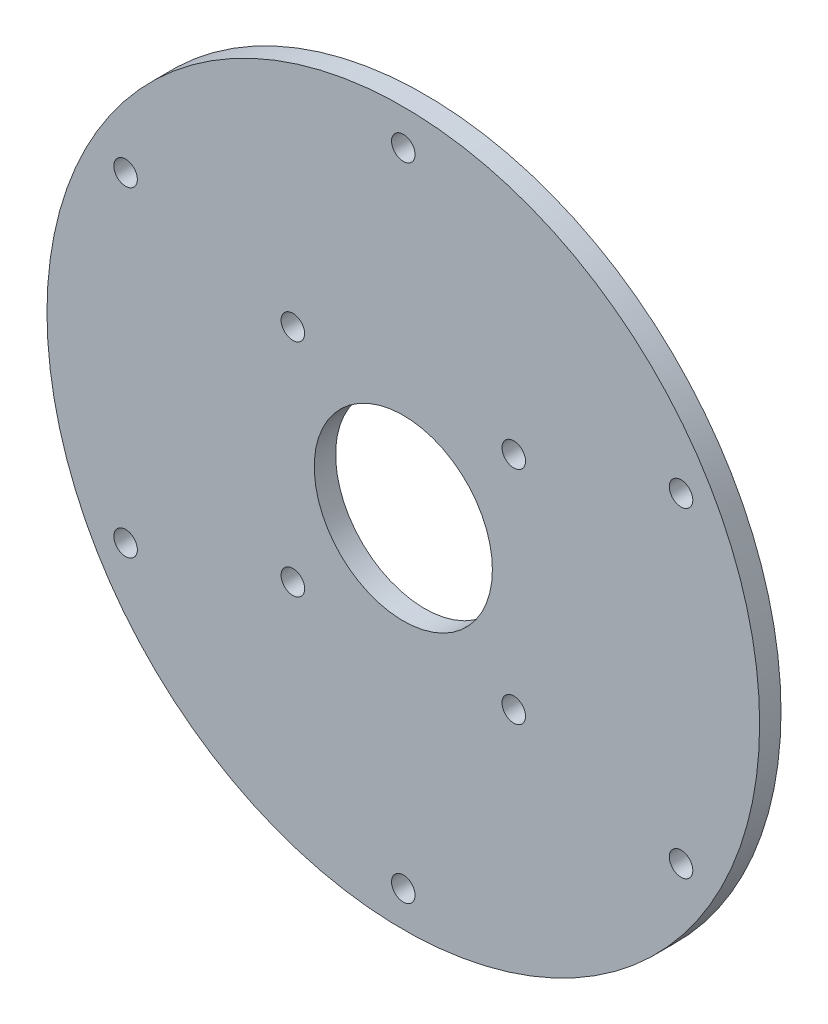
ISO-10303-21;
HEADER;
FILE_DESCRIPTION(('STEP AP214'),'2;1');
FILE_NAME('part.step','',(''),(''),'','','');
FILE_SCHEMA(('AUTOMOTIVE_DESIGN { 1 0 10303 214 1 1 1 1 }'));
ENDSEC;
DATA;
#1=APPLICATION_CONTEXT('core data for automotive mechanical design processes');
#2=APPLICATION_PROTOCOL_DEFINITION('international standard','automotive_design',2000,#1);
#3=PRODUCT_CONTEXT('',#1,'mechanical');
#4=PRODUCT('Part','Part','',(#3));
#5=PRODUCT_RELATED_PRODUCT_CATEGORY('part','',(#4));
#6=PRODUCT_DEFINITION_FORMATION('','',#4);
#7=PRODUCT_DEFINITION_CONTEXT('part definition',#1,'design');
#8=PRODUCT_DEFINITION('design','',#6,#7);
#9=PRODUCT_DEFINITION_SHAPE('','',#8);
#10=(LENGTH_UNIT() NAMED_UNIT(*) SI_UNIT(.MILLI.,.METRE.));
#11=(NAMED_UNIT(*) PLANE_ANGLE_UNIT() SI_UNIT($,.RADIAN.));
#12=(NAMED_UNIT(*) SI_UNIT($,.STERADIAN.) SOLID_ANGLE_UNIT());
#13=UNCERTAINTY_MEASURE_WITH_UNIT(LENGTH_MEASURE(1.E-05),#10,'distance_accuracy_value','');
#14=(GEOMETRIC_REPRESENTATION_CONTEXT(3) GLOBAL_UNCERTAINTY_ASSIGNED_CONTEXT((#13)) GLOBAL_UNIT_ASSIGNED_CONTEXT((#10,
#11,#12)) REPRESENTATION_CONTEXT('',''));
#15=CARTESIAN_POINT('',(0.,0.,0.));
#16=DIRECTION('',(0.,0.,1.));
#17=DIRECTION('',(1.,0.,0.));
#18=AXIS2_PLACEMENT_3D('',#15,#16,#17);
#19=CARTESIAN_POINT('',(0.,0.,3.));
#20=DIRECTION('',(0.,0.,1.));
#21=DIRECTION('',(1.,0.,0.));
#22=AXIS2_PLACEMENT_3D('',#19,#20,#21);
#23=PLANE('',#22);
#24=CARTESIAN_POINT('',(-2.94902990916057E-13,-45.,3.));
#25=DIRECTION('',(0.,0.,1.));
#26=DIRECTION('',(1.,0.,0.));
#27=AXIS2_PLACEMENT_3D('',#24,#25,#26);
#28=CIRCLE('',#27,1.65);
#29=CARTESIAN_POINT('',(1.64999999999971,-45.,3.));
#30=VERTEX_POINT('',#29);
#31=EDGE_CURVE('E103',#30,#30,#28,.T.);
#32=ORIENTED_EDGE('',*,*,#31,.F.);
#33=EDGE_LOOP('',(#32));
#34=FACE_BOUND('',#33,.T.);
#35=CARTESIAN_POINT('',(38.9711431702998,22.4999999999999,3.));
#36=DIRECTION('',(0.,0.,1.));
#37=DIRECTION('',(1.,0.,0.));
#38=AXIS2_PLACEMENT_3D('',#35,#36,#37);
#39=CIRCLE('',#38,1.65);
#40=CARTESIAN_POINT('',(40.6211431702998,22.4999999999999,3.));
#41=VERTEX_POINT('',#40);
#42=EDGE_CURVE('E91',#41,#41,#39,.T.);
#43=ORIENTED_EDGE('',*,*,#42,.F.);
#44=EDGE_LOOP('',(#43));
#45=FACE_BOUND('',#44,.T.);
#46=CARTESIAN_POINT('',(-15.5000000000002,-15.4999999999998,3.));
#47=DIRECTION('',(0.,0.,1.));
#48=DIRECTION('',(1.,0.,0.));
#49=AXIS2_PLACEMENT_3D('',#46,#47,#48);
#50=CIRCLE('',#49,1.65);
#51=CARTESIAN_POINT('',(-13.8500000000002,-15.4999999999998,3.));
#52=VERTEX_POINT('',#51);
#53=EDGE_CURVE('E79',#52,#52,#50,.T.);
#54=ORIENTED_EDGE('',*,*,#53,.F.);
#55=EDGE_LOOP('',(#54));
#56=FACE_BOUND('',#55,.T.);
#57=CARTESIAN_POINT('',(15.5000000000001,15.4999999999999,3.));
#58=DIRECTION('',(0.,0.,1.));
#59=DIRECTION('',(1.,0.,0.));
#60=AXIS2_PLACEMENT_3D('',#57,#58,#59);
#61=CIRCLE('',#60,1.65);
#62=CARTESIAN_POINT('',(17.1500000000001,15.4999999999999,3.));
#63=VERTEX_POINT('',#62);
#64=EDGE_CURVE('E67',#63,#63,#61,.T.);
#65=ORIENTED_EDGE('',*,*,#64,.F.);
#66=EDGE_LOOP('',(#65));
#67=FACE_BOUND('',#66,.T.);
#68=CARTESIAN_POINT('',(0.,0.,3.));
#69=DIRECTION('',(0.,0.,1.));
#70=DIRECTION('',(1.,0.,0.));
#71=AXIS2_PLACEMENT_3D('',#68,#69,#70);
#72=CIRCLE('',#71,12.5);
#73=CARTESIAN_POINT('',(12.5,0.,3.));
#74=VERTEX_POINT('',#73);
#75=EDGE_CURVE('E55',#74,#74,#72,.T.);
#76=ORIENTED_EDGE('',*,*,#75,.F.);
#77=EDGE_LOOP('',(#76));
#78=FACE_BOUND('',#77,.T.);
#79=CARTESIAN_POINT('',(0.,0.,3.));
#80=DIRECTION('',(0.,0.,1.));
#81=DIRECTION('',(1.,0.,0.));
#82=AXIS2_PLACEMENT_3D('',#79,#80,#81);
#83=CIRCLE('',#82,50.);
#84=CARTESIAN_POINT('',(50.,0.,3.));
#85=VERTEX_POINT('',#84);
#86=EDGE_CURVE('E10',#85,#85,#83,.T.);
#87=ORIENTED_EDGE('',*,*,#86,.T.);
#88=EDGE_LOOP('',(#87));
#89=FACE_BOUND('',#88,.T.);
#90=CARTESIAN_POINT('',(-15.5,15.5,3.));
#91=DIRECTION('',(0.,0.,1.));
#92=DIRECTION('',(1.,0.,0.));
#93=AXIS2_PLACEMENT_3D('',#90,#91,#92);
#94=CIRCLE('',#93,1.65);
#95=CARTESIAN_POINT('',(-13.85,15.5,3.));
#96=VERTEX_POINT('',#95);
#97=EDGE_CURVE('E50',#96,#96,#94,.T.);
#98=ORIENTED_EDGE('',*,*,#97,.F.);
#99=EDGE_LOOP('',(#98));
#100=FACE_BOUND('',#99,.T.);
#101=CARTESIAN_POINT('',(-38.9711431702998,22.4999999999999,3.));
#102=DIRECTION('',(0.,0.,1.));
#103=DIRECTION('',(1.,0.,0.));
#104=AXIS2_PLACEMENT_3D('',#101,#102,#103);
#105=CIRCLE('',#104,1.65);
#106=CARTESIAN_POINT('',(-37.3211431702998,22.4999999999999,3.));
#107=VERTEX_POINT('',#106);
#108=EDGE_CURVE('E61',#107,#107,#105,.T.);
#109=ORIENTED_EDGE('',*,*,#108,.F.);
#110=EDGE_LOOP('',(#109));
#111=FACE_BOUND('',#110,.T.);
#112=CARTESIAN_POINT('',(15.4999999999999,-15.5000000000001,3.));
#113=DIRECTION('',(0.,0.,1.));
#114=DIRECTION('',(1.,0.,0.));
#115=AXIS2_PLACEMENT_3D('',#112,#113,#114);
#116=CIRCLE('',#115,1.65);
#117=CARTESIAN_POINT('',(17.1499999999999,-15.5000000000001,3.));
#118=VERTEX_POINT('',#117);
#119=EDGE_CURVE('E73',#118,#118,#116,.T.);
#120=ORIENTED_EDGE('',*,*,#119,.F.);
#121=EDGE_LOOP('',(#120));
#122=FACE_BOUND('',#121,.T.);
#123=CARTESIAN_POINT('',(0.,45.,3.));
#124=DIRECTION('',(0.,0.,1.));
#125=DIRECTION('',(1.,0.,0.));
#126=AXIS2_PLACEMENT_3D('',#123,#124,#125);
#127=CIRCLE('',#126,1.65000000000001);
#128=CARTESIAN_POINT('',(1.64999999999998,45.,3.));
#129=VERTEX_POINT('',#128);
#130=EDGE_CURVE('E85',#129,#129,#127,.T.);
#131=ORIENTED_EDGE('',*,*,#130,.F.);
#132=EDGE_LOOP('',(#131));
#133=FACE_BOUND('',#132,.T.);
#134=CARTESIAN_POINT('',(38.9711431702997,-22.5000000000002,3.));
#135=DIRECTION('',(0.,0.,1.));
#136=DIRECTION('',(1.,0.,0.));
#137=AXIS2_PLACEMENT_3D('',#134,#135,#136);
#138=CIRCLE('',#137,1.65);
#139=CARTESIAN_POINT('',(40.6211431702997,-22.5000000000002,3.));
#140=VERTEX_POINT('',#139);
#141=EDGE_CURVE('E97',#140,#140,#138,.T.);
#142=ORIENTED_EDGE('',*,*,#141,.F.);
#143=EDGE_LOOP('',(#142));
#144=FACE_BOUND('',#143,.T.);
#145=CARTESIAN_POINT('',(-38.9711431702999,-22.4999999999997,3.));
#146=DIRECTION('',(0.,0.,1.));
#147=DIRECTION('',(1.,0.,0.));
#148=AXIS2_PLACEMENT_3D('',#145,#146,#147);
#149=CIRCLE('',#148,1.65);
#150=CARTESIAN_POINT('',(-37.3211431702999,-22.4999999999997,3.));
#151=VERTEX_POINT('',#150);
#152=EDGE_CURVE('E109',#151,#151,#149,.T.);
#153=ORIENTED_EDGE('',*,*,#152,.F.);
#154=EDGE_LOOP('',(#153));
#155=FACE_BOUND('',#154,.T.);
#156=ADVANCED_FACE('F39',(#34,#45,#56,#67,#78,#89,#100,#111,#122,#133,#144,#155),#23,.T.);
#157=CARTESIAN_POINT('',(0.,0.,0.));
#158=DIRECTION('',(0.,0.,1.));
#159=DIRECTION('',(1.,0.,0.));
#160=AXIS2_PLACEMENT_3D('',#157,#158,#159);
#161=PLANE('',#160);
#162=CARTESIAN_POINT('',(0.,0.,0.));
#163=DIRECTION('',(0.,0.,1.));
#164=DIRECTION('',(1.,0.,0.));
#165=AXIS2_PLACEMENT_3D('',#162,#163,#164);
#166=CIRCLE('',#165,50.);
#167=CARTESIAN_POINT('',(50.,0.,0.));
#168=VERTEX_POINT('',#167);
#169=EDGE_CURVE('E43',#168,#168,#166,.T.);
#170=ORIENTED_EDGE('',*,*,#169,.F.);
#171=EDGE_LOOP('',(#170));
#172=FACE_BOUND('',#171,.T.);
#173=CARTESIAN_POINT('',(-15.5,15.5,0.));
#174=DIRECTION('',(0.,0.,1.));
#175=DIRECTION('',(1.,0.,0.));
#176=AXIS2_PLACEMENT_3D('',#173,#174,#175);
#177=CIRCLE('',#176,1.65);
#178=CARTESIAN_POINT('',(-13.85,15.5,0.));
#179=VERTEX_POINT('',#178);
#180=EDGE_CURVE('E52',#179,#179,#177,.T.);
#181=ORIENTED_EDGE('',*,*,#180,.T.);
#182=EDGE_LOOP('',(#181));
#183=FACE_BOUND('',#182,.T.);
#184=CARTESIAN_POINT('',(0.,0.,0.));
#185=DIRECTION('',(0.,0.,1.));
#186=DIRECTION('',(1.,0.,0.));
#187=AXIS2_PLACEMENT_3D('',#184,#185,#186);
#188=CIRCLE('',#187,12.5);
#189=CARTESIAN_POINT('',(12.5,0.,0.));
#190=VERTEX_POINT('',#189);
#191=EDGE_CURVE('E58',#190,#190,#188,.T.);
#192=ORIENTED_EDGE('',*,*,#191,.T.);
#193=EDGE_LOOP('',(#192));
#194=FACE_BOUND('',#193,.T.);
#195=CARTESIAN_POINT('',(-38.9711431702998,22.4999999999999,0.));
#196=DIRECTION('',(0.,0.,1.));
#197=DIRECTION('',(1.,0.,0.));
#198=AXIS2_PLACEMENT_3D('',#195,#196,#197);
#199=CIRCLE('',#198,1.65);
#200=CARTESIAN_POINT('',(-37.3211431702998,22.4999999999999,0.));
#201=VERTEX_POINT('',#200);
#202=EDGE_CURVE('E64',#201,#201,#199,.T.);
#203=ORIENTED_EDGE('',*,*,#202,.T.);
#204=EDGE_LOOP('',(#203));
#205=FACE_BOUND('',#204,.T.);
#206=CARTESIAN_POINT('',(15.5000000000001,15.4999999999999,0.));
#207=DIRECTION('',(0.,0.,1.));
#208=DIRECTION('',(1.,0.,0.));
#209=AXIS2_PLACEMENT_3D('',#206,#207,#208);
#210=CIRCLE('',#209,1.65);
#211=CARTESIAN_POINT('',(17.1500000000001,15.4999999999999,0.));
#212=VERTEX_POINT('',#211);
#213=EDGE_CURVE('E70',#212,#212,#210,.T.);
#214=ORIENTED_EDGE('',*,*,#213,.T.);
#215=EDGE_LOOP('',(#214));
#216=FACE_BOUND('',#215,.T.);
#217=CARTESIAN_POINT('',(15.4999999999999,-15.5000000000001,0.));
#218=DIRECTION('',(0.,0.,1.));
#219=DIRECTION('',(1.,0.,0.));
#220=AXIS2_PLACEMENT_3D('',#217,#218,#219);
#221=CIRCLE('',#220,1.65);
#222=CARTESIAN_POINT('',(17.1499999999999,-15.5000000000001,0.));
#223=VERTEX_POINT('',#222);
#224=EDGE_CURVE('E76',#223,#223,#221,.T.);
#225=ORIENTED_EDGE('',*,*,#224,.T.);
#226=EDGE_LOOP('',(#225));
#227=FACE_BOUND('',#226,.T.);
#228=CARTESIAN_POINT('',(-15.5000000000002,-15.4999999999998,0.));
#229=DIRECTION('',(0.,0.,1.));
#230=DIRECTION('',(1.,0.,0.));
#231=AXIS2_PLACEMENT_3D('',#228,#229,#230);
#232=CIRCLE('',#231,1.65);
#233=CARTESIAN_POINT('',(-13.8500000000002,-15.4999999999998,0.));
#234=VERTEX_POINT('',#233);
#235=EDGE_CURVE('E82',#234,#234,#232,.T.);
#236=ORIENTED_EDGE('',*,*,#235,.T.);
#237=EDGE_LOOP('',(#236));
#238=FACE_BOUND('',#237,.T.);
#239=CARTESIAN_POINT('',(0.,45.,0.));
#240=DIRECTION('',(0.,0.,1.));
#241=DIRECTION('',(1.,0.,0.));
#242=AXIS2_PLACEMENT_3D('',#239,#240,#241);
#243=CIRCLE('',#242,1.65000000000001);
#244=CARTESIAN_POINT('',(1.64999999999998,45.,0.));
#245=VERTEX_POINT('',#244);
#246=EDGE_CURVE('E88',#245,#245,#243,.T.);
#247=ORIENTED_EDGE('',*,*,#246,.T.);
#248=EDGE_LOOP('',(#247));
#249=FACE_BOUND('',#248,.T.);
#250=CARTESIAN_POINT('',(38.9711431702998,22.4999999999999,0.));
#251=DIRECTION('',(0.,0.,1.));
#252=DIRECTION('',(1.,0.,0.));
#253=AXIS2_PLACEMENT_3D('',#250,#251,#252);
#254=CIRCLE('',#253,1.65);
#255=CARTESIAN_POINT('',(40.6211431702998,22.4999999999999,0.));
#256=VERTEX_POINT('',#255);
#257=EDGE_CURVE('E94',#256,#256,#254,.T.);
#258=ORIENTED_EDGE('',*,*,#257,.T.);
#259=EDGE_LOOP('',(#258));
#260=FACE_BOUND('',#259,.T.);
#261=CARTESIAN_POINT('',(38.9711431702997,-22.5000000000002,0.));
#262=DIRECTION('',(0.,0.,1.));
#263=DIRECTION('',(1.,0.,0.));
#264=AXIS2_PLACEMENT_3D('',#261,#262,#263);
#265=CIRCLE('',#264,1.65);
#266=CARTESIAN_POINT('',(40.6211431702997,-22.5000000000002,0.));
#267=VERTEX_POINT('',#266);
#268=EDGE_CURVE('E100',#267,#267,#265,.T.);
#269=ORIENTED_EDGE('',*,*,#268,.T.);
#270=EDGE_LOOP('',(#269));
#271=FACE_BOUND('',#270,.T.);
#272=CARTESIAN_POINT('',(-2.94902990916057E-13,-45.,0.));
#273=DIRECTION('',(0.,0.,1.));
#274=DIRECTION('',(1.,0.,0.));
#275=AXIS2_PLACEMENT_3D('',#272,#273,#274);
#276=CIRCLE('',#275,1.65);
#277=CARTESIAN_POINT('',(1.64999999999971,-45.,0.));
#278=VERTEX_POINT('',#277);
#279=EDGE_CURVE('E106',#278,#278,#276,.T.);
#280=ORIENTED_EDGE('',*,*,#279,.T.);
#281=EDGE_LOOP('',(#280));
#282=FACE_BOUND('',#281,.T.);
#283=CARTESIAN_POINT('',(-38.9711431702999,-22.4999999999997,0.));
#284=DIRECTION('',(0.,0.,1.));
#285=DIRECTION('',(1.,0.,0.));
#286=AXIS2_PLACEMENT_3D('',#283,#284,#285);
#287=CIRCLE('',#286,1.65);
#288=CARTESIAN_POINT('',(-37.3211431702999,-22.4999999999997,0.));
#289=VERTEX_POINT('',#288);
#290=EDGE_CURVE('E112',#289,#289,#287,.T.);
#291=ORIENTED_EDGE('',*,*,#290,.T.);
#292=EDGE_LOOP('',(#291));
#293=FACE_BOUND('',#292,.T.);
#294=ADVANCED_FACE('F122',(#172,#183,#194,#205,#216,#227,#238,#249,#260,#271,#282,#293),#161,.F.);
#295=CARTESIAN_POINT('',(0.,0.,3.));
#296=DIRECTION('',(0.,0.,-1.));
#297=DIRECTION('',(-1.,0.,0.));
#298=AXIS2_PLACEMENT_3D('',#295,#296,#297);
#299=CYLINDRICAL_SURFACE('',#298,50.);
#300=ORIENTED_EDGE('',*,*,#86,.F.);
#301=EDGE_LOOP('',(#300));
#302=FACE_BOUND('',#301,.T.);
#303=ORIENTED_EDGE('',*,*,#169,.T.);
#304=EDGE_LOOP('',(#303));
#305=FACE_BOUND('',#304,.T.);
#306=ADVANCED_FACE('F41',(#302,#305),#299,.T.);
#307=CARTESIAN_POINT('',(-15.5,15.5,3.));
#308=DIRECTION('',(0.,0.,-1.));
#309=DIRECTION('',(-1.,0.,0.));
#310=AXIS2_PLACEMENT_3D('',#307,#308,#309);
#311=CYLINDRICAL_SURFACE('',#310,1.65);
#312=ORIENTED_EDGE('',*,*,#97,.T.);
#313=EDGE_LOOP('',(#312));
#314=FACE_BOUND('',#313,.T.);
#315=ORIENTED_EDGE('',*,*,#180,.F.);
#316=EDGE_LOOP('',(#315));
#317=FACE_BOUND('',#316,.T.);
#318=ADVANCED_FACE('F132',(#314,#317),#311,.F.);
#319=CARTESIAN_POINT('',(0.,0.,3.));
#320=DIRECTION('',(0.,0.,-1.));
#321=DIRECTION('',(-1.,0.,0.));
#322=AXIS2_PLACEMENT_3D('',#319,#320,#321);
#323=CYLINDRICAL_SURFACE('',#322,12.5);
#324=ORIENTED_EDGE('',*,*,#75,.T.);
#325=EDGE_LOOP('',(#324));
#326=FACE_BOUND('',#325,.T.);
#327=ORIENTED_EDGE('',*,*,#191,.F.);
#328=EDGE_LOOP('',(#327));
#329=FACE_BOUND('',#328,.T.);
#330=ADVANCED_FACE('F135',(#326,#329),#323,.F.);
#331=CARTESIAN_POINT('',(-38.9711431702998,22.4999999999999,3.));
#332=DIRECTION('',(0.,0.,-1.));
#333=DIRECTION('',(-1.,0.,0.));
#334=AXIS2_PLACEMENT_3D('',#331,#332,#333);
#335=CYLINDRICAL_SURFACE('',#334,1.65);
#336=ORIENTED_EDGE('',*,*,#108,.T.);
#337=EDGE_LOOP('',(#336));
#338=FACE_BOUND('',#337,.T.);
#339=ORIENTED_EDGE('',*,*,#202,.F.);
#340=EDGE_LOOP('',(#339));
#341=FACE_BOUND('',#340,.T.);
#342=ADVANCED_FACE('F139',(#338,#341),#335,.F.);
#343=CARTESIAN_POINT('',(15.5000000000001,15.4999999999999,3.));
#344=DIRECTION('',(0.,0.,-1.));
#345=DIRECTION('',(-1.,0.,0.));
#346=AXIS2_PLACEMENT_3D('',#343,#344,#345);
#347=CYLINDRICAL_SURFACE('',#346,1.65);
#348=ORIENTED_EDGE('',*,*,#64,.T.);
#349=EDGE_LOOP('',(#348));
#350=FACE_BOUND('',#349,.T.);
#351=ORIENTED_EDGE('',*,*,#213,.F.);
#352=EDGE_LOOP('',(#351));
#353=FACE_BOUND('',#352,.T.);
#354=ADVANCED_FACE('F143',(#350,#353),#347,.F.);
#355=CARTESIAN_POINT('',(15.4999999999999,-15.5000000000001,3.));
#356=DIRECTION('',(0.,0.,-1.));
#357=DIRECTION('',(-1.,0.,0.));
#358=AXIS2_PLACEMENT_3D('',#355,#356,#357);
#359=CYLINDRICAL_SURFACE('',#358,1.65);
#360=ORIENTED_EDGE('',*,*,#119,.T.);
#361=EDGE_LOOP('',(#360));
#362=FACE_BOUND('',#361,.T.);
#363=ORIENTED_EDGE('',*,*,#224,.F.);
#364=EDGE_LOOP('',(#363));
#365=FACE_BOUND('',#364,.T.);
#366=ADVANCED_FACE('F147',(#362,#365),#359,.F.);
#367=CARTESIAN_POINT('',(-15.5000000000002,-15.4999999999998,3.));
#368=DIRECTION('',(0.,0.,-1.));
#369=DIRECTION('',(-1.,0.,0.));
#370=AXIS2_PLACEMENT_3D('',#367,#368,#369);
#371=CYLINDRICAL_SURFACE('',#370,1.65);
#372=ORIENTED_EDGE('',*,*,#53,.T.);
#373=EDGE_LOOP('',(#372));
#374=FACE_BOUND('',#373,.T.);
#375=ORIENTED_EDGE('',*,*,#235,.F.);
#376=EDGE_LOOP('',(#375));
#377=FACE_BOUND('',#376,.T.);
#378=ADVANCED_FACE('F151',(#374,#377),#371,.F.);
#379=CARTESIAN_POINT('',(0.,45.,3.));
#380=DIRECTION('',(0.,0.,-1.));
#381=DIRECTION('',(-1.,0.,0.));
#382=AXIS2_PLACEMENT_3D('',#379,#380,#381);
#383=CYLINDRICAL_SURFACE('',#382,1.65000000000001);
#384=ORIENTED_EDGE('',*,*,#130,.T.);
#385=EDGE_LOOP('',(#384));
#386=FACE_BOUND('',#385,.T.);
#387=ORIENTED_EDGE('',*,*,#246,.F.);
#388=EDGE_LOOP('',(#387));
#389=FACE_BOUND('',#388,.T.);
#390=ADVANCED_FACE('F155',(#386,#389),#383,.F.);
#391=CARTESIAN_POINT('',(38.9711431702998,22.4999999999999,3.));
#392=DIRECTION('',(0.,0.,-1.));
#393=DIRECTION('',(-1.,0.,0.));
#394=AXIS2_PLACEMENT_3D('',#391,#392,#393);
#395=CYLINDRICAL_SURFACE('',#394,1.65);
#396=ORIENTED_EDGE('',*,*,#42,.T.);
#397=EDGE_LOOP('',(#396));
#398=FACE_BOUND('',#397,.T.);
#399=ORIENTED_EDGE('',*,*,#257,.F.);
#400=EDGE_LOOP('',(#399));
#401=FACE_BOUND('',#400,.T.);
#402=ADVANCED_FACE('F159',(#398,#401),#395,.F.);
#403=CARTESIAN_POINT('',(38.9711431702997,-22.5000000000002,3.));
#404=DIRECTION('',(0.,0.,-1.));
#405=DIRECTION('',(-1.,0.,0.));
#406=AXIS2_PLACEMENT_3D('',#403,#404,#405);
#407=CYLINDRICAL_SURFACE('',#406,1.65);
#408=ORIENTED_EDGE('',*,*,#141,.T.);
#409=EDGE_LOOP('',(#408));
#410=FACE_BOUND('',#409,.T.);
#411=ORIENTED_EDGE('',*,*,#268,.F.);
#412=EDGE_LOOP('',(#411));
#413=FACE_BOUND('',#412,.T.);
#414=ADVANCED_FACE('F163',(#410,#413),#407,.F.);
#415=CARTESIAN_POINT('',(-2.94902990916057E-13,-45.,3.));
#416=DIRECTION('',(0.,0.,-1.));
#417=DIRECTION('',(-1.,0.,0.));
#418=AXIS2_PLACEMENT_3D('',#415,#416,#417);
#419=CYLINDRICAL_SURFACE('',#418,1.65);
#420=ORIENTED_EDGE('',*,*,#31,.T.);
#421=EDGE_LOOP('',(#420));
#422=FACE_BOUND('',#421,.T.);
#423=ORIENTED_EDGE('',*,*,#279,.F.);
#424=EDGE_LOOP('',(#423));
#425=FACE_BOUND('',#424,.T.);
#426=ADVANCED_FACE('F167',(#422,#425),#419,.F.);
#427=CARTESIAN_POINT('',(-38.9711431702999,-22.4999999999997,3.));
#428=DIRECTION('',(0.,0.,-1.));
#429=DIRECTION('',(-1.,0.,0.));
#430=AXIS2_PLACEMENT_3D('',#427,#428,#429);
#431=CYLINDRICAL_SURFACE('',#430,1.65);
#432=ORIENTED_EDGE('',*,*,#152,.T.);
#433=EDGE_LOOP('',(#432));
#434=FACE_BOUND('',#433,.T.);
#435=ORIENTED_EDGE('',*,*,#290,.F.);
#436=EDGE_LOOP('',(#435));
#437=FACE_BOUND('',#436,.T.);
#438=ADVANCED_FACE('F118',(#434,#437),#431,.F.);
#439=CLOSED_SHELL('',(#156,#294,#306,#318,#330,#342,#354,#366,#378,#390,#402,#414,#426,#438));
#440=MANIFOLD_SOLID_BREP('B2',#439);
#441=ADVANCED_BREP_SHAPE_REPRESENTATION('',(#18,#440),#14);
#442=SHAPE_DEFINITION_REPRESENTATION(#9,#441);
ENDSEC;
END-ISO-10303-21;
